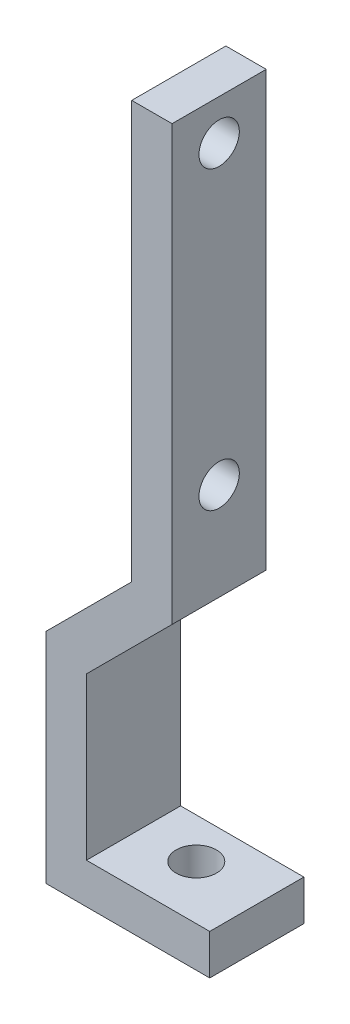
ISO-10303-21;
HEADER;
FILE_DESCRIPTION(('STEP AP214'),'2;1');
FILE_NAME('part.step','',(''),(''),'','','');
FILE_SCHEMA(('AUTOMOTIVE_DESIGN { 1 0 10303 214 1 1 1 1 }'));
ENDSEC;
DATA;
#1=APPLICATION_CONTEXT('core data for automotive mechanical design processes');
#2=APPLICATION_PROTOCOL_DEFINITION('international standard','automotive_design',2000,#1);
#3=PRODUCT_CONTEXT('',#1,'mechanical');
#4=PRODUCT('Part','Part','',(#3));
#5=PRODUCT_RELATED_PRODUCT_CATEGORY('part','',(#4));
#6=PRODUCT_DEFINITION_FORMATION('','',#4);
#7=PRODUCT_DEFINITION_CONTEXT('part definition',#1,'design');
#8=PRODUCT_DEFINITION('design','',#6,#7);
#9=PRODUCT_DEFINITION_SHAPE('','',#8);
#10=(LENGTH_UNIT() NAMED_UNIT(*) SI_UNIT(.MILLI.,.METRE.));
#11=(NAMED_UNIT(*) PLANE_ANGLE_UNIT() SI_UNIT($,.RADIAN.));
#12=(NAMED_UNIT(*) SI_UNIT($,.STERADIAN.) SOLID_ANGLE_UNIT());
#13=UNCERTAINTY_MEASURE_WITH_UNIT(LENGTH_MEASURE(1.E-05),#10,'distance_accuracy_value','');
#14=(GEOMETRIC_REPRESENTATION_CONTEXT(3) GLOBAL_UNCERTAINTY_ASSIGNED_CONTEXT((#13)) GLOBAL_UNIT_ASSIGNED_CONTEXT((#10,
#11,#12)) REPRESENTATION_CONTEXT('',''));
#15=CARTESIAN_POINT('',(0.,0.,0.));
#16=DIRECTION('',(0.,0.,1.));
#17=DIRECTION('',(1.,0.,0.));
#18=AXIS2_PLACEMENT_3D('',#15,#16,#17);
#19=CARTESIAN_POINT('',(0.,-31.6198785237269,7.));
#20=DIRECTION('',(0.,1.,0.));
#21=DIRECTION('',(0.,0.,1.));
#22=AXIS2_PLACEMENT_3D('',#19,#20,#21);
#23=PLANE('',#22);
#24=CARTESIAN_POINT('',(-2.84108024311403,-31.6198785237269,3.));
#25=DIRECTION('',(0.,1.,0.));
#26=DIRECTION('',(0.,0.,1.));
#27=AXIS2_PLACEMENT_3D('',#24,#25,#26);
#28=CIRCLE('',#27,1.5);
#29=CARTESIAN_POINT('',(-2.84108024311403,-31.6198785237269,4.5));
#30=VERTEX_POINT('',#29);
#31=EDGE_CURVE('E220',#30,#30,#28,.T.);
#32=ORIENTED_EDGE('',*,*,#31,.T.);
#33=EDGE_LOOP('',(#32));
#34=FACE_BOUND('',#33,.T.);
#35=DIRECTION('',(1.,0.,0.));
#36=VECTOR('',#35,1.);
#37=CARTESIAN_POINT('',(0.,-31.6198785237269,0.));
#38=LINE('',#37,#36);
#39=CARTESIAN_POINT('',(-10.005041273793,-31.6198785237269,0.));
#40=VERTEX_POINT('',#39);
#41=CARTESIAN_POINT('',(2.15891975688597,-31.6198785237269,0.));
#42=VERTEX_POINT('',#41);
#43=EDGE_CURVE('E145',#40,#42,#38,.T.);
#44=ORIENTED_EDGE('',*,*,#43,.T.);
#45=DIRECTION('',(0.,0.,-1.));
#46=VECTOR('',#45,1.);
#47=CARTESIAN_POINT('',(2.15891975688597,-31.6198785237269,7.));
#48=LINE('',#47,#46);
#49=CARTESIAN_POINT('',(2.15891975688597,-31.6198785237269,7.));
#50=VERTEX_POINT('',#49);
#51=EDGE_CURVE('E11',#50,#42,#48,.T.);
#52=ORIENTED_EDGE('',*,*,#51,.F.);
#53=DIRECTION('',(1.,0.,0.));
#54=VECTOR('',#53,1.);
#55=CARTESIAN_POINT('',(0.,-31.6198785237269,7.));
#56=LINE('',#55,#54);
#57=CARTESIAN_POINT('',(-10.005041273793,-31.6198785237269,7.));
#58=VERTEX_POINT('',#57);
#59=EDGE_CURVE('E164',#58,#50,#56,.T.);
#60=ORIENTED_EDGE('',*,*,#59,.F.);
#61=DIRECTION('',(0.,0.,-1.));
#62=VECTOR('',#61,1.);
#63=CARTESIAN_POINT('',(-10.005041273793,-31.6198785237269,7.));
#64=LINE('',#63,#62);
#65=EDGE_CURVE('E141',#58,#40,#64,.T.);
#66=ORIENTED_EDGE('',*,*,#65,.T.);
#67=EDGE_LOOP('',(#44,#52,#60,#66));
#68=FACE_BOUND('',#67,.T.);
#69=ADVANCED_FACE('F37',(#34,#68),#23,.F.);
#70=CARTESIAN_POINT('',(2.15891975688597,0.,7.));
#71=DIRECTION('',(-1.,0.,0.));
#72=DIRECTION('',(0.,-1.,0.));
#73=AXIS2_PLACEMENT_3D('',#70,#71,#72);
#74=PLANE('',#73);
#75=DIRECTION('',(0.,1.,0.));
#76=VECTOR('',#75,1.);
#77=CARTESIAN_POINT('',(2.15891975688597,0.,0.));
#78=LINE('',#77,#76);
#79=CARTESIAN_POINT('',(2.15891975688597,-28.6198785237269,0.));
#80=VERTEX_POINT('',#79);
#81=EDGE_CURVE('E148',#42,#80,#78,.T.);
#82=ORIENTED_EDGE('',*,*,#81,.T.);
#83=DIRECTION('',(0.,0.,-1.));
#84=VECTOR('',#83,1.);
#85=CARTESIAN_POINT('',(2.15891975688597,-28.6198785237269,7.));
#86=LINE('',#85,#84);
#87=CARTESIAN_POINT('',(2.15891975688597,-28.6198785237269,7.));
#88=VERTEX_POINT('',#87);
#89=EDGE_CURVE('E45',#88,#80,#86,.T.);
#90=ORIENTED_EDGE('',*,*,#89,.F.);
#91=DIRECTION('',(0.,1.,0.));
#92=VECTOR('',#91,1.);
#93=CARTESIAN_POINT('',(2.15891975688597,0.,7.));
#94=LINE('',#93,#92);
#95=EDGE_CURVE('E102',#50,#88,#94,.T.);
#96=ORIENTED_EDGE('',*,*,#95,.F.);
#97=ORIENTED_EDGE('',*,*,#51,.T.);
#98=EDGE_LOOP('',(#82,#90,#96,#97));
#99=FACE_BOUND('',#98,.T.);
#100=ADVANCED_FACE('F233',(#99),#74,.F.);
#101=CARTESIAN_POINT('',(0.,-28.6198785237269,7.));
#102=DIRECTION('',(0.,-1.,0.));
#103=DIRECTION('',(0.,0.,-1.));
#104=AXIS2_PLACEMENT_3D('',#101,#102,#103);
#105=PLANE('',#104);
#106=CARTESIAN_POINT('',(-2.84108024311403,-28.6198785237269,3.));
#107=DIRECTION('',(0.,1.,0.));
#108=DIRECTION('',(0.,0.,1.));
#109=AXIS2_PLACEMENT_3D('',#106,#107,#108);
#110=CIRCLE('',#109,1.5);
#111=CARTESIAN_POINT('',(-2.84108024311403,-28.6198785237269,4.5));
#112=VERTEX_POINT('',#111);
#113=EDGE_CURVE('E225',#112,#112,#110,.T.);
#114=ORIENTED_EDGE('',*,*,#113,.F.);
#115=EDGE_LOOP('',(#114));
#116=FACE_BOUND('',#115,.T.);
#117=DIRECTION('',(-1.,0.,0.));
#118=VECTOR('',#117,1.);
#119=CARTESIAN_POINT('',(0.,-28.6198785237269,0.));
#120=LINE('',#119,#118);
#121=CARTESIAN_POINT('',(-7.00504127379296,-28.6198785237269,0.));
#122=VERTEX_POINT('',#121);
#123=EDGE_CURVE('E151',#80,#122,#120,.T.);
#124=ORIENTED_EDGE('',*,*,#123,.T.);
#125=DIRECTION('',(0.,0.,-1.));
#126=VECTOR('',#125,1.);
#127=CARTESIAN_POINT('',(-7.00504127379296,-28.6198785237269,7.));
#128=LINE('',#127,#126);
#129=CARTESIAN_POINT('',(-7.00504127379296,-28.6198785237269,7.));
#130=VERTEX_POINT('',#129);
#131=EDGE_CURVE('E177',#130,#122,#128,.T.);
#132=ORIENTED_EDGE('',*,*,#131,.F.);
#133=DIRECTION('',(-1.,0.,0.));
#134=VECTOR('',#133,1.);
#135=CARTESIAN_POINT('',(0.,-28.6198785237269,7.));
#136=LINE('',#135,#134);
#137=EDGE_CURVE('E185',#88,#130,#136,.T.);
#138=ORIENTED_EDGE('',*,*,#137,.F.);
#139=ORIENTED_EDGE('',*,*,#89,.T.);
#140=EDGE_LOOP('',(#124,#132,#138,#139));
#141=FACE_BOUND('',#140,.T.);
#142=ADVANCED_FACE('F183',(#116,#141),#105,.F.);
#143=CARTESIAN_POINT('',(-7.00504127379296,0.,7.));
#144=DIRECTION('',(-1.,0.,0.));
#145=DIRECTION('',(0.,-1.,0.));
#146=AXIS2_PLACEMENT_3D('',#143,#144,#145);
#147=PLANE('',#146);
#148=DIRECTION('',(0.,1.,0.));
#149=VECTOR('',#148,1.);
#150=CARTESIAN_POINT('',(-7.00504127379296,0.,0.));
#151=LINE('',#150,#149);
#152=CARTESIAN_POINT('',(-7.00504127379296,-16.6198785237268,0.));
#153=VERTEX_POINT('',#152);
#154=EDGE_CURVE('E153',#122,#153,#151,.T.);
#155=ORIENTED_EDGE('',*,*,#154,.T.);
#156=DIRECTION('',(0.,0.,-1.));
#157=VECTOR('',#156,1.);
#158=CARTESIAN_POINT('',(-7.00504127379296,-16.6198785237268,7.));
#159=LINE('',#158,#157);
#160=CARTESIAN_POINT('',(-7.00504127379296,-16.6198785237268,7.));
#161=VERTEX_POINT('',#160);
#162=EDGE_CURVE('E174',#161,#153,#159,.T.);
#163=ORIENTED_EDGE('',*,*,#162,.F.);
#164=DIRECTION('',(0.,1.,0.));
#165=VECTOR('',#164,1.);
#166=CARTESIAN_POINT('',(-7.00504127379296,0.,7.));
#167=LINE('',#166,#165);
#168=EDGE_CURVE('E203',#130,#161,#167,.T.);
#169=ORIENTED_EDGE('',*,*,#168,.F.);
#170=ORIENTED_EDGE('',*,*,#131,.T.);
#171=EDGE_LOOP('',(#155,#163,#169,#170));
#172=FACE_BOUND('',#171,.T.);
#173=ADVANCED_FACE('F194',(#172),#147,.F.);
#174=CARTESIAN_POINT('',(4.80741862496694,-4.80741862496694,7.));
#175=DIRECTION('',(-0.707106781186547,0.707106781186547,0.));
#176=DIRECTION('',(-0.707106781186548,-0.707106781186548,0.));
#177=AXIS2_PLACEMENT_3D('',#174,#175,#176);
#178=PLANE('',#177);
#179=DIRECTION('',(0.707106781186548,0.707106781186548,0.));
#180=VECTOR('',#179,1.);
#181=CARTESIAN_POINT('',(4.80741862496694,-4.80741862496694,0.));
#182=LINE('',#181,#180);
#183=CARTESIAN_POINT('',(-0.64108024311404,-10.2559174930479,0.));
#184=VERTEX_POINT('',#183);
#185=EDGE_CURVE('E155',#153,#184,#182,.T.);
#186=ORIENTED_EDGE('',*,*,#185,.T.);
#187=DIRECTION('',(0.,0.,-1.));
#188=VECTOR('',#187,1.);
#189=CARTESIAN_POINT('',(-0.64108024311404,-10.2559174930479,7.));
#190=LINE('',#189,#188);
#191=CARTESIAN_POINT('',(-0.64108024311404,-10.2559174930479,7.));
#192=VERTEX_POINT('',#191);
#193=EDGE_CURVE('E171',#192,#184,#190,.T.);
#194=ORIENTED_EDGE('',*,*,#193,.F.);
#195=DIRECTION('',(0.707106781186548,0.707106781186548,0.));
#196=VECTOR('',#195,1.);
#197=CARTESIAN_POINT('',(4.80741862496694,-4.80741862496694,7.));
#198=LINE('',#197,#196);
#199=EDGE_CURVE('E200',#161,#192,#198,.T.);
#200=ORIENTED_EDGE('',*,*,#199,.F.);
#201=ORIENTED_EDGE('',*,*,#162,.T.);
#202=EDGE_LOOP('',(#186,#194,#200,#201));
#203=FACE_BOUND('',#202,.T.);
#204=ADVANCED_FACE('F198',(#203),#178,.F.);
#205=CARTESIAN_POINT('',(-0.641080243114038,0.,7.));
#206=DIRECTION('',(-1.,0.,0.));
#207=DIRECTION('',(0.,0.,1.));
#208=AXIS2_PLACEMENT_3D('',#205,#206,#207);
#209=PLANE('',#208);
#210=CARTESIAN_POINT('',(-0.641080243114038,18.9867231940714,3.5));
#211=DIRECTION('',(-1.,0.,0.));
#212=DIRECTION('',(0.,0.,1.));
#213=AXIS2_PLACEMENT_3D('',#210,#211,#212);
#214=CIRCLE('',#213,1.5);
#215=CARTESIAN_POINT('',(-0.641080243114038,18.9867231940714,5.));
#216=VERTEX_POINT('',#215);
#217=EDGE_CURVE('E149',#216,#216,#214,.T.);
#218=ORIENTED_EDGE('',*,*,#217,.T.);
#219=EDGE_LOOP('',(#218));
#220=FACE_BOUND('',#219,.T.);
#221=CARTESIAN_POINT('',(-0.641080243114039,-3.01327680592863,3.5));
#222=DIRECTION('',(-1.,0.,0.));
#223=DIRECTION('',(0.,0.,1.));
#224=AXIS2_PLACEMENT_3D('',#221,#222,#223);
#225=CIRCLE('',#224,1.5);
#226=CARTESIAN_POINT('',(-0.641080243114039,-3.01327680592863,5.));
#227=VERTEX_POINT('',#226);
#228=EDGE_CURVE('E213',#227,#227,#225,.T.);
#229=ORIENTED_EDGE('',*,*,#228,.T.);
#230=EDGE_LOOP('',(#229));
#231=FACE_BOUND('',#230,.T.);
#232=DIRECTION('',(0.,1.,0.));
#233=VECTOR('',#232,1.);
#234=CARTESIAN_POINT('',(-0.641080243114038,0.,0.));
#235=LINE('',#234,#233);
#236=CARTESIAN_POINT('',(-0.641080243114038,21.9867231940714,0.));
#237=VERTEX_POINT('',#236);
#238=EDGE_CURVE('E157',#184,#237,#235,.T.);
#239=ORIENTED_EDGE('',*,*,#238,.T.);
#240=DIRECTION('',(0.,0.,-1.));
#241=VECTOR('',#240,1.);
#242=CARTESIAN_POINT('',(-0.641080243114038,21.9867231940714,7.));
#243=LINE('',#242,#241);
#244=CARTESIAN_POINT('',(-0.641080243114038,21.9867231940714,7.));
#245=VERTEX_POINT('',#244);
#246=EDGE_CURVE('E168',#245,#237,#243,.T.);
#247=ORIENTED_EDGE('',*,*,#246,.F.);
#248=DIRECTION('',(0.,1.,0.));
#249=VECTOR('',#248,1.);
#250=CARTESIAN_POINT('',(-0.641080243114038,0.,7.));
#251=LINE('',#250,#249);
#252=EDGE_CURVE('E202',#192,#245,#251,.T.);
#253=ORIENTED_EDGE('',*,*,#252,.F.);
#254=ORIENTED_EDGE('',*,*,#193,.T.);
#255=EDGE_LOOP('',(#239,#247,#253,#254));
#256=FACE_BOUND('',#255,.T.);
#257=ADVANCED_FACE('F253',(#220,#231,#256),#209,.F.);
#258=CARTESIAN_POINT('',(0.,21.9867231940714,7.));
#259=DIRECTION('',(0.,-1.,0.));
#260=DIRECTION('',(1.,0.,0.));
#261=AXIS2_PLACEMENT_3D('',#258,#259,#260);
#262=PLANE('',#261);
#263=DIRECTION('',(-1.,0.,0.));
#264=VECTOR('',#263,1.);
#265=CARTESIAN_POINT('',(0.,21.9867231940714,0.));
#266=LINE('',#265,#264);
#267=CARTESIAN_POINT('',(-3.64108024311404,21.9867231940714,0.));
#268=VERTEX_POINT('',#267);
#269=EDGE_CURVE('E159',#237,#268,#266,.T.);
#270=ORIENTED_EDGE('',*,*,#269,.T.);
#271=DIRECTION('',(0.,0.,-1.));
#272=VECTOR('',#271,1.);
#273=CARTESIAN_POINT('',(-3.64108024311404,21.9867231940714,7.));
#274=LINE('',#273,#272);
#275=CARTESIAN_POINT('',(-3.64108024311404,21.9867231940714,7.));
#276=VERTEX_POINT('',#275);
#277=EDGE_CURVE('E136',#276,#268,#274,.T.);
#278=ORIENTED_EDGE('',*,*,#277,.F.);
#279=DIRECTION('',(-1.,0.,0.));
#280=VECTOR('',#279,1.);
#281=CARTESIAN_POINT('',(0.,21.9867231940714,7.));
#282=LINE('',#281,#280);
#283=EDGE_CURVE('E127',#245,#276,#282,.T.);
#284=ORIENTED_EDGE('',*,*,#283,.F.);
#285=ORIENTED_EDGE('',*,*,#246,.T.);
#286=EDGE_LOOP('',(#270,#278,#284,#285));
#287=FACE_BOUND('',#286,.T.);
#288=ADVANCED_FACE('F250',(#287),#262,.F.);
#289=CARTESIAN_POINT('',(-3.64108024311404,0.,7.));
#290=DIRECTION('',(1.,0.,0.));
#291=DIRECTION('',(0.,1.,0.));
#292=AXIS2_PLACEMENT_3D('',#289,#290,#291);
#293=PLANE('',#292);
#294=CARTESIAN_POINT('',(-3.64108024311404,18.9867231940714,3.5));
#295=DIRECTION('',(-1.,0.,0.));
#296=DIRECTION('',(0.,-1.,0.));
#297=AXIS2_PLACEMENT_3D('',#294,#295,#296);
#298=CIRCLE('',#297,1.5);
#299=CARTESIAN_POINT('',(-3.64108024311404,17.4867231940714,3.5));
#300=VERTEX_POINT('',#299);
#301=EDGE_CURVE('E216',#300,#300,#298,.T.);
#302=ORIENTED_EDGE('',*,*,#301,.F.);
#303=EDGE_LOOP('',(#302));
#304=FACE_BOUND('',#303,.T.);
#305=CARTESIAN_POINT('',(-3.64108024311404,-3.01327680592863,3.5));
#306=DIRECTION('',(-1.,0.,0.));
#307=DIRECTION('',(0.,-1.,0.));
#308=AXIS2_PLACEMENT_3D('',#305,#306,#307);
#309=CIRCLE('',#308,1.5);
#310=CARTESIAN_POINT('',(-3.64108024311404,-4.51327680592863,3.5));
#311=VERTEX_POINT('',#310);
#312=EDGE_CURVE('E217',#311,#311,#309,.T.);
#313=ORIENTED_EDGE('',*,*,#312,.F.);
#314=EDGE_LOOP('',(#313));
#315=FACE_BOUND('',#314,.T.);
#316=DIRECTION('',(0.,-1.,0.));
#317=VECTOR('',#316,1.);
#318=CARTESIAN_POINT('',(-3.64108024311404,0.,0.));
#319=LINE('',#318,#317);
#320=CARTESIAN_POINT('',(-3.64108024311403,-9.01327680592864,0.));
#321=VERTEX_POINT('',#320);
#322=EDGE_CURVE('E135',#268,#321,#319,.T.);
#323=ORIENTED_EDGE('',*,*,#322,.T.);
#324=DIRECTION('',(0.,0.,-1.));
#325=VECTOR('',#324,1.);
#326=CARTESIAN_POINT('',(-3.64108024311403,-9.01327680592864,7.));
#327=LINE('',#326,#325);
#328=CARTESIAN_POINT('',(-3.64108024311403,-9.01327680592864,7.));
#329=VERTEX_POINT('',#328);
#330=EDGE_CURVE('E132',#329,#321,#327,.T.);
#331=ORIENTED_EDGE('',*,*,#330,.F.);
#332=DIRECTION('',(0.,-1.,0.));
#333=VECTOR('',#332,1.);
#334=CARTESIAN_POINT('',(-3.64108024311404,0.,7.));
#335=LINE('',#334,#333);
#336=EDGE_CURVE('E121',#276,#329,#335,.T.);
#337=ORIENTED_EDGE('',*,*,#336,.F.);
#338=ORIENTED_EDGE('',*,*,#277,.T.);
#339=EDGE_LOOP('',(#323,#331,#337,#338));
#340=FACE_BOUND('',#339,.T.);
#341=ADVANCED_FACE('F133',(#304,#315,#340),#293,.F.);
#342=CARTESIAN_POINT('',(2.6860982814073,-2.6860982814073,7.));
#343=DIRECTION('',(0.707106781186548,-0.707106781186548,0.));
#344=DIRECTION('',(0.707106781186548,0.707106781186547,0.));
#345=AXIS2_PLACEMENT_3D('',#342,#343,#344);
#346=PLANE('',#345);
#347=DIRECTION('',(-0.707106781186548,-0.707106781186547,0.));
#348=VECTOR('',#347,1.);
#349=CARTESIAN_POINT('',(2.6860982814073,-2.6860982814073,0.));
#350=LINE('',#349,#348);
#351=CARTESIAN_POINT('',(-10.005041273793,-15.3772378366076,0.));
#352=VERTEX_POINT('',#351);
#353=EDGE_CURVE('E88',#321,#352,#350,.T.);
#354=ORIENTED_EDGE('',*,*,#353,.T.);
#355=DIRECTION('',(0.,0.,-1.));
#356=VECTOR('',#355,1.);
#357=CARTESIAN_POINT('',(-10.005041273793,-15.3772378366076,7.));
#358=LINE('',#357,#356);
#359=CARTESIAN_POINT('',(-10.005041273793,-15.3772378366076,7.));
#360=VERTEX_POINT('',#359);
#361=EDGE_CURVE('E137',#360,#352,#358,.T.);
#362=ORIENTED_EDGE('',*,*,#361,.F.);
#363=DIRECTION('',(-0.707106781186548,-0.707106781186547,0.));
#364=VECTOR('',#363,1.);
#365=CARTESIAN_POINT('',(2.6860982814073,-2.6860982814073,7.));
#366=LINE('',#365,#364);
#367=EDGE_CURVE('E125',#329,#360,#366,.T.);
#368=ORIENTED_EDGE('',*,*,#367,.F.);
#369=ORIENTED_EDGE('',*,*,#330,.T.);
#370=EDGE_LOOP('',(#354,#362,#368,#369));
#371=FACE_BOUND('',#370,.T.);
#372=ADVANCED_FACE('F139',(#371),#346,.F.);
#373=CARTESIAN_POINT('',(-10.005041273793,0.,7.));
#374=DIRECTION('',(1.,0.,0.));
#375=DIRECTION('',(0.,1.,0.));
#376=AXIS2_PLACEMENT_3D('',#373,#374,#375);
#377=PLANE('',#376);
#378=DIRECTION('',(0.,-1.,0.));
#379=VECTOR('',#378,1.);
#380=CARTESIAN_POINT('',(-10.005041273793,0.,0.));
#381=LINE('',#380,#379);
#382=EDGE_CURVE('E94',#352,#40,#381,.T.);
#383=ORIENTED_EDGE('',*,*,#382,.T.);
#384=ORIENTED_EDGE('',*,*,#65,.F.);
#385=DIRECTION('',(0.,-1.,0.));
#386=VECTOR('',#385,1.);
#387=CARTESIAN_POINT('',(-10.005041273793,0.,7.));
#388=LINE('',#387,#386);
#389=EDGE_CURVE('E53',#360,#58,#388,.T.);
#390=ORIENTED_EDGE('',*,*,#389,.F.);
#391=ORIENTED_EDGE('',*,*,#361,.T.);
#392=EDGE_LOOP('',(#383,#384,#390,#391));
#393=FACE_BOUND('',#392,.T.);
#394=ADVANCED_FACE('F270',(#393),#377,.F.);
#395=CARTESIAN_POINT('',(0.,0.,7.));
#396=DIRECTION('',(0.,0.,1.));
#397=DIRECTION('',(1.,0.,0.));
#398=AXIS2_PLACEMENT_3D('',#395,#396,#397);
#399=PLANE('',#398);
#400=ORIENTED_EDGE('',*,*,#59,.T.);
#401=ORIENTED_EDGE('',*,*,#95,.T.);
#402=ORIENTED_EDGE('',*,*,#137,.T.);
#403=ORIENTED_EDGE('',*,*,#168,.T.);
#404=ORIENTED_EDGE('',*,*,#199,.T.);
#405=ORIENTED_EDGE('',*,*,#252,.T.);
#406=ORIENTED_EDGE('',*,*,#283,.T.);
#407=ORIENTED_EDGE('',*,*,#336,.T.);
#408=ORIENTED_EDGE('',*,*,#367,.T.);
#409=ORIENTED_EDGE('',*,*,#389,.T.);
#410=EDGE_LOOP('',(#400,#401,#402,#403,#404,#405,#406,#407,#408,#409));
#411=FACE_BOUND('',#410,.T.);
#412=ADVANCED_FACE('F123',(#411),#399,.T.);
#413=CARTESIAN_POINT('',(0.,0.,0.));
#414=DIRECTION('',(0.,0.,1.));
#415=DIRECTION('',(1.,0.,0.));
#416=AXIS2_PLACEMENT_3D('',#413,#414,#415);
#417=PLANE('',#416);
#418=ORIENTED_EDGE('',*,*,#43,.F.);
#419=ORIENTED_EDGE('',*,*,#382,.F.);
#420=ORIENTED_EDGE('',*,*,#353,.F.);
#421=ORIENTED_EDGE('',*,*,#322,.F.);
#422=ORIENTED_EDGE('',*,*,#269,.F.);
#423=ORIENTED_EDGE('',*,*,#238,.F.);
#424=ORIENTED_EDGE('',*,*,#185,.F.);
#425=ORIENTED_EDGE('',*,*,#154,.F.);
#426=ORIENTED_EDGE('',*,*,#123,.F.);
#427=ORIENTED_EDGE('',*,*,#81,.F.);
#428=EDGE_LOOP('',(#418,#419,#420,#421,#422,#423,#424,#425,#426,#427));
#429=FACE_BOUND('',#428,.T.);
#430=ADVANCED_FACE('F189',(#429),#417,.F.);
#431=CARTESIAN_POINT('',(3.35891975688596,-3.01327680592863,3.5));
#432=DIRECTION('',(-1.,0.,0.));
#433=DIRECTION('',(0.,-1.,0.));
#434=AXIS2_PLACEMENT_3D('',#431,#432,#433);
#435=CYLINDRICAL_SURFACE('',#434,1.5);
#436=ORIENTED_EDGE('',*,*,#312,.T.);
#437=EDGE_LOOP('',(#436));
#438=FACE_BOUND('',#437,.T.);
#439=ORIENTED_EDGE('',*,*,#228,.F.);
#440=EDGE_LOOP('',(#439));
#441=FACE_BOUND('',#440,.T.);
#442=ADVANCED_FACE('F275',(#438,#441),#435,.F.);
#443=CARTESIAN_POINT('',(3.35891975688596,18.9867231940714,3.5));
#444=DIRECTION('',(-1.,0.,0.));
#445=DIRECTION('',(0.,-1.,0.));
#446=AXIS2_PLACEMENT_3D('',#443,#444,#445);
#447=CYLINDRICAL_SURFACE('',#446,1.5);
#448=ORIENTED_EDGE('',*,*,#301,.T.);
#449=EDGE_LOOP('',(#448));
#450=FACE_BOUND('',#449,.T.);
#451=ORIENTED_EDGE('',*,*,#217,.F.);
#452=EDGE_LOOP('',(#451));
#453=FACE_BOUND('',#452,.T.);
#454=ADVANCED_FACE('F280',(#450,#453),#447,.F.);
#455=CARTESIAN_POINT('',(-2.84108024311403,-35.6198785237269,3.));
#456=DIRECTION('',(0.,1.,0.));
#457=DIRECTION('',(0.,0.,1.));
#458=AXIS2_PLACEMENT_3D('',#455,#456,#457);
#459=CYLINDRICAL_SURFACE('',#458,1.5);
#460=ORIENTED_EDGE('',*,*,#113,.T.);
#461=EDGE_LOOP('',(#460));
#462=FACE_BOUND('',#461,.T.);
#463=ORIENTED_EDGE('',*,*,#31,.F.);
#464=EDGE_LOOP('',(#463));
#465=FACE_BOUND('',#464,.T.);
#466=ADVANCED_FACE('F229',(#462,#465),#459,.F.);
#467=CLOSED_SHELL('',(#69,#100,#142,#173,#204,#257,#288,#341,#372,#394,#412,#430,#442,#454,#466));
#468=MANIFOLD_SOLID_BREP('B2',#467);
#469=ADVANCED_BREP_SHAPE_REPRESENTATION('',(#18,#468),#14);
#470=SHAPE_DEFINITION_REPRESENTATION(#9,#469);
ENDSEC;
END-ISO-10303-21;
